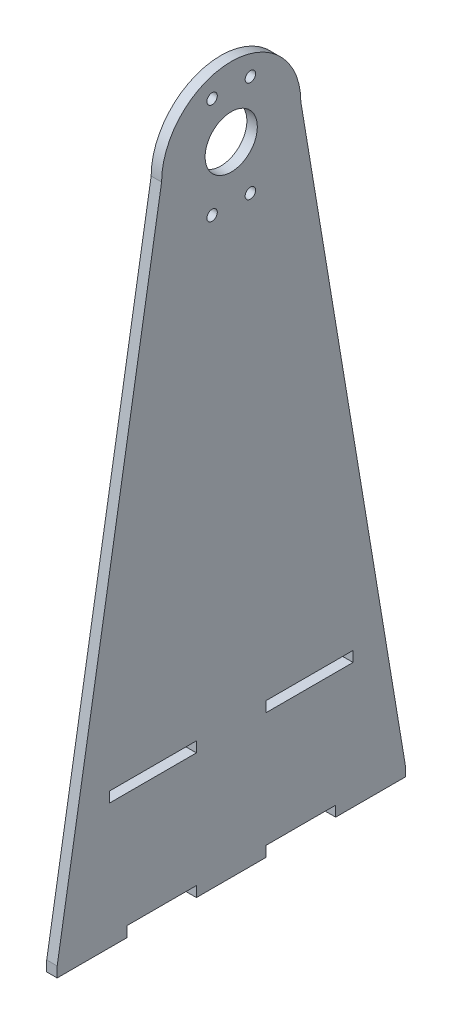
ISO-10303-21;
HEADER;
FILE_DESCRIPTION(('STEP AP214'),'2;1');
FILE_NAME('part.step','',(''),(''),'','','');
FILE_SCHEMA(('AUTOMOTIVE_DESIGN { 1 0 10303 214 1 1 1 1 }'));
ENDSEC;
DATA;
#1=APPLICATION_CONTEXT('core data for automotive mechanical design processes');
#2=APPLICATION_PROTOCOL_DEFINITION('international standard','automotive_design',2000,#1);
#3=PRODUCT_CONTEXT('',#1,'mechanical');
#4=PRODUCT('Part','Part','',(#3));
#5=PRODUCT_RELATED_PRODUCT_CATEGORY('part','',(#4));
#6=PRODUCT_DEFINITION_FORMATION('','',#4);
#7=PRODUCT_DEFINITION_CONTEXT('part definition',#1,'design');
#8=PRODUCT_DEFINITION('design','',#6,#7);
#9=PRODUCT_DEFINITION_SHAPE('','',#8);
#10=(LENGTH_UNIT() NAMED_UNIT(*) SI_UNIT(.MILLI.,.METRE.));
#11=(NAMED_UNIT(*) PLANE_ANGLE_UNIT() SI_UNIT($,.RADIAN.));
#12=(NAMED_UNIT(*) SI_UNIT($,.STERADIAN.) SOLID_ANGLE_UNIT());
#13=UNCERTAINTY_MEASURE_WITH_UNIT(LENGTH_MEASURE(1.E-05),#10,'distance_accuracy_value','');
#14=(GEOMETRIC_REPRESENTATION_CONTEXT(3) GLOBAL_UNCERTAINTY_ASSIGNED_CONTEXT((#13)) GLOBAL_UNIT_ASSIGNED_CONTEXT((#10,
#11,#12)) REPRESENTATION_CONTEXT('',''));
#15=CARTESIAN_POINT('',(0.,0.,0.));
#16=DIRECTION('',(0.,0.,1.));
#17=DIRECTION('',(1.,0.,0.));
#18=AXIS2_PLACEMENT_3D('',#15,#16,#17);
#19=CARTESIAN_POINT('',(1.5,180.,0.));
#20=DIRECTION('',(1.,0.,0.));
#21=DIRECTION('',(0.,0.,-1.));
#22=AXIS2_PLACEMENT_3D('',#19,#20,#21);
#23=PLANE('',#22);
#24=CARTESIAN_POINT('',(1.5,164.5,5.5));
#25=DIRECTION('',(1.,0.,0.));
#26=DIRECTION('',(0.,0.,-1.));
#27=AXIS2_PLACEMENT_3D('',#24,#25,#26);
#28=CIRCLE('',#27,1.5);
#29=CARTESIAN_POINT('',(1.5,164.5,4.));
#30=VERTEX_POINT('',#29);
#31=EDGE_CURVE('E436',#30,#30,#28,.F.);
#32=ORIENTED_EDGE('',*,*,#31,.T.);
#33=EDGE_LOOP('',(#32));
#34=FACE_BOUND('',#33,.T.);
#35=CARTESIAN_POINT('',(1.5,193.5,5.5));
#36=DIRECTION('',(1.,0.,0.));
#37=DIRECTION('',(0.,0.,-1.));
#38=AXIS2_PLACEMENT_3D('',#35,#36,#37);
#39=CIRCLE('',#38,1.5);
#40=CARTESIAN_POINT('',(1.5,193.5,4.));
#41=VERTEX_POINT('',#40);
#42=EDGE_CURVE('E223',#41,#41,#39,.T.);
#43=ORIENTED_EDGE('',*,*,#42,.F.);
#44=EDGE_LOOP('',(#43));
#45=FACE_BOUND('',#44,.T.);
#46=DIRECTION('',(0.,-1.,0.));
#47=VECTOR('',#46,1.);
#48=CARTESIAN_POINT('',(1.5,180.,-10.));
#49=LINE('',#48,#47);
#50=CARTESIAN_POINT('',(1.5,36.,-10.));
#51=VERTEX_POINT('',#50);
#52=CARTESIAN_POINT('',(1.5,33.,-10.));
#53=VERTEX_POINT('',#52);
#54=EDGE_CURVE('E360',#51,#53,#49,.T.);
#55=ORIENTED_EDGE('',*,*,#54,.F.);
#56=DIRECTION('',(0.,0.,1.));
#57=VECTOR('',#56,1.);
#58=CARTESIAN_POINT('',(1.5,36.,0.));
#59=LINE('',#58,#57);
#60=CARTESIAN_POINT('',(1.5,36.,-35.));
#61=VERTEX_POINT('',#60);
#62=EDGE_CURVE('E353',#61,#51,#59,.T.);
#63=ORIENTED_EDGE('',*,*,#62,.F.);
#64=DIRECTION('',(0.,1.,0.));
#65=VECTOR('',#64,1.);
#66=CARTESIAN_POINT('',(1.5,180.,-35.));
#67=LINE('',#66,#65);
#68=CARTESIAN_POINT('',(1.5,33.,-35.));
#69=VERTEX_POINT('',#68);
#70=EDGE_CURVE('E355',#69,#61,#67,.T.);
#71=ORIENTED_EDGE('',*,*,#70,.F.);
#72=DIRECTION('',(0.,0.,-1.));
#73=VECTOR('',#72,1.);
#74=CARTESIAN_POINT('',(1.5,33.,0.));
#75=LINE('',#74,#73);
#76=EDGE_CURVE('E358',#53,#69,#75,.T.);
#77=ORIENTED_EDGE('',*,*,#76,.F.);
#78=EDGE_LOOP('',(#55,#63,#71,#77));
#79=FACE_BOUND('',#78,.T.);
#80=DIRECTION('',(0.,0.,1.));
#81=VECTOR('',#80,1.);
#82=CARTESIAN_POINT('',(1.5,36.,0.));
#83=LINE('',#82,#81);
#84=CARTESIAN_POINT('',(1.5,36.,10.));
#85=VERTEX_POINT('',#84);
#86=CARTESIAN_POINT('',(1.5,36.,35.));
#87=VERTEX_POINT('',#86);
#88=EDGE_CURVE('E351',#85,#87,#83,.T.);
#89=ORIENTED_EDGE('',*,*,#88,.F.);
#90=DIRECTION('',(0.,1.,0.));
#91=VECTOR('',#90,1.);
#92=CARTESIAN_POINT('',(1.5,180.,10.));
#93=LINE('',#92,#91);
#94=CARTESIAN_POINT('',(1.5,33.,10.));
#95=VERTEX_POINT('',#94);
#96=EDGE_CURVE('E320',#95,#85,#93,.T.);
#97=ORIENTED_EDGE('',*,*,#96,.F.);
#98=DIRECTION('',(0.,0.,-1.));
#99=VECTOR('',#98,1.);
#100=CARTESIAN_POINT('',(1.5,33.,0.));
#101=LINE('',#100,#99);
#102=CARTESIAN_POINT('',(1.5,33.,35.));
#103=VERTEX_POINT('',#102);
#104=EDGE_CURVE('E346',#103,#95,#101,.T.);
#105=ORIENTED_EDGE('',*,*,#104,.F.);
#106=DIRECTION('',(0.,-1.,0.));
#107=VECTOR('',#106,1.);
#108=CARTESIAN_POINT('',(1.5,180.,35.));
#109=LINE('',#108,#107);
#110=EDGE_CURVE('E349',#87,#103,#109,.T.);
#111=ORIENTED_EDGE('',*,*,#110,.F.);
#112=EDGE_LOOP('',(#89,#97,#105,#111));
#113=FACE_BOUND('',#112,.T.);
#114=DIRECTION('',(0.,0.986393923832144,0.164398987305357));
#115=VECTOR('',#114,1.);
#116=CARTESIAN_POINT('',(1.5,0.,-50.));
#117=LINE('',#116,#115);
#118=CARTESIAN_POINT('',(1.5,0.,-50.));
#119=VERTEX_POINT('',#118);
#120=CARTESIAN_POINT('',(1.5,180.,-20.));
#121=VERTEX_POINT('',#120);
#122=EDGE_CURVE('E267',#119,#121,#117,.T.);
#123=ORIENTED_EDGE('',*,*,#122,.T.);
#124=CARTESIAN_POINT('',(1.5,180.,0.));
#125=DIRECTION('',(1.,0.,0.));
#126=DIRECTION('',(0.,0.,-1.));
#127=AXIS2_PLACEMENT_3D('',#124,#125,#126);
#128=CIRCLE('',#127,20.);
#129=CARTESIAN_POINT('',(1.5,180.,20.));
#130=VERTEX_POINT('',#129);
#131=EDGE_CURVE('E270',#121,#130,#128,.T.);
#132=ORIENTED_EDGE('',*,*,#131,.T.);
#133=DIRECTION('',(0.,-0.986393923832144,0.164398987305357));
#134=VECTOR('',#133,1.);
#135=CARTESIAN_POINT('',(1.5,0.,50.));
#136=LINE('',#135,#134);
#137=CARTESIAN_POINT('',(1.5,0.,50.));
#138=VERTEX_POINT('',#137);
#139=EDGE_CURVE('E368',#130,#138,#136,.T.);
#140=ORIENTED_EDGE('',*,*,#139,.T.);
#141=DIRECTION('',(0.,1.,0.));
#142=VECTOR('',#141,1.);
#143=CARTESIAN_POINT('',(1.5,-3.00000000000001,50.));
#144=LINE('',#143,#142);
#145=CARTESIAN_POINT('',(1.5,-3.00000000000001,50.));
#146=VERTEX_POINT('',#145);
#147=EDGE_CURVE('E211',#146,#138,#144,.T.);
#148=ORIENTED_EDGE('',*,*,#147,.F.);
#149=DIRECTION('',(0.,0.,1.));
#150=VECTOR('',#149,1.);
#151=CARTESIAN_POINT('',(1.5,-3.,30.));
#152=LINE('',#151,#150);
#153=CARTESIAN_POINT('',(1.5,-3.,30.));
#154=VERTEX_POINT('',#153);
#155=EDGE_CURVE('E418',#154,#146,#152,.T.);
#156=ORIENTED_EDGE('',*,*,#155,.F.);
#157=DIRECTION('',(0.,1.,0.));
#158=VECTOR('',#157,1.);
#159=CARTESIAN_POINT('',(1.5,-3.,30.));
#160=LINE('',#159,#158);
#161=CARTESIAN_POINT('',(1.5,0.,30.));
#162=VERTEX_POINT('',#161);
#163=EDGE_CURVE('E419',#154,#162,#160,.T.);
#164=ORIENTED_EDGE('',*,*,#163,.T.);
#165=DIRECTION('',(0.,0.,-1.));
#166=VECTOR('',#165,1.);
#167=CARTESIAN_POINT('',(1.5,0.,-50.));
#168=LINE('',#167,#166);
#169=CARTESIAN_POINT('',(1.5,0.,10.));
#170=VERTEX_POINT('',#169);
#171=EDGE_CURVE('E52',#162,#170,#168,.T.);
#172=ORIENTED_EDGE('',*,*,#171,.T.);
#173=DIRECTION('',(0.,1.,0.));
#174=VECTOR('',#173,1.);
#175=CARTESIAN_POINT('',(1.5,-3.,10.));
#176=LINE('',#175,#174);
#177=CARTESIAN_POINT('',(1.5,-3.,10.));
#178=VERTEX_POINT('',#177);
#179=EDGE_CURVE('E297',#178,#170,#176,.T.);
#180=ORIENTED_EDGE('',*,*,#179,.F.);
#181=DIRECTION('',(0.,0.,1.));
#182=VECTOR('',#181,1.);
#183=CARTESIAN_POINT('',(1.5,-3.,0.));
#184=LINE('',#183,#182);
#185=CARTESIAN_POINT('',(1.5,-3.,-10.));
#186=VERTEX_POINT('',#185);
#187=EDGE_CURVE('E379',#186,#178,#184,.T.);
#188=ORIENTED_EDGE('',*,*,#187,.F.);
#189=DIRECTION('',(0.,1.,0.));
#190=VECTOR('',#189,1.);
#191=CARTESIAN_POINT('',(1.5,-3.,-10.));
#192=LINE('',#191,#190);
#193=CARTESIAN_POINT('',(1.5,0.,-9.99999999999999));
#194=VERTEX_POINT('',#193);
#195=EDGE_CURVE('E294',#186,#194,#192,.T.);
#196=ORIENTED_EDGE('',*,*,#195,.T.);
#197=CARTESIAN_POINT('',(1.5,0.,-30.));
#198=VERTEX_POINT('',#197);
#199=EDGE_CURVE('E369',#194,#198,#168,.T.);
#200=ORIENTED_EDGE('',*,*,#199,.T.);
#201=DIRECTION('',(0.,1.,0.));
#202=VECTOR('',#201,1.);
#203=CARTESIAN_POINT('',(1.5,-3.,-30.));
#204=LINE('',#203,#202);
#205=CARTESIAN_POINT('',(1.5,-3.,-30.));
#206=VERTEX_POINT('',#205);
#207=EDGE_CURVE('E376',#206,#198,#204,.T.);
#208=ORIENTED_EDGE('',*,*,#207,.F.);
#209=DIRECTION('',(0.,0.,1.));
#210=VECTOR('',#209,1.);
#211=CARTESIAN_POINT('',(1.5,-3.,0.));
#212=LINE('',#211,#210);
#213=CARTESIAN_POINT('',(1.5,-2.99999999999999,-50.));
#214=VERTEX_POINT('',#213);
#215=EDGE_CURVE('E387',#214,#206,#212,.T.);
#216=ORIENTED_EDGE('',*,*,#215,.F.);
#217=DIRECTION('',(0.,1.,0.));
#218=VECTOR('',#217,1.);
#219=CARTESIAN_POINT('',(1.5,-2.99999999999999,-50.));
#220=LINE('',#219,#218);
#221=EDGE_CURVE('E400',#214,#119,#220,.T.);
#222=ORIENTED_EDGE('',*,*,#221,.T.);
#223=EDGE_LOOP('',(#123,#132,#140,#148,#156,#164,#172,#180,#188,#196,#200,#208,#216,#222));
#224=FACE_BOUND('',#223,.T.);
#225=CARTESIAN_POINT('',(1.5,180.,0.));
#226=DIRECTION('',(1.,0.,0.));
#227=DIRECTION('',(0.,0.,-1.));
#228=AXIS2_PLACEMENT_3D('',#225,#226,#227);
#229=CIRCLE('',#228,7.5);
#230=CARTESIAN_POINT('',(1.5,180.,-7.5));
#231=VERTEX_POINT('',#230);
#232=EDGE_CURVE('E263',#231,#231,#229,.T.);
#233=ORIENTED_EDGE('',*,*,#232,.F.);
#234=EDGE_LOOP('',(#233));
#235=FACE_BOUND('',#234,.T.);
#236=CARTESIAN_POINT('',(1.5,164.5,-5.5));
#237=DIRECTION('',(1.,0.,0.));
#238=DIRECTION('',(0.,0.,-1.));
#239=AXIS2_PLACEMENT_3D('',#236,#237,#238);
#240=CIRCLE('',#239,1.5);
#241=CARTESIAN_POINT('',(1.5,164.5,-7.));
#242=VERTEX_POINT('',#241);
#243=EDGE_CURVE('E440',#242,#242,#240,.T.);
#244=ORIENTED_EDGE('',*,*,#243,.F.);
#245=EDGE_LOOP('',(#244));
#246=FACE_BOUND('',#245,.T.);
#247=CARTESIAN_POINT('',(1.5,193.5,-5.5));
#248=DIRECTION('',(-1.,0.,0.));
#249=DIRECTION('',(0.,0.,1.));
#250=AXIS2_PLACEMENT_3D('',#247,#248,#249);
#251=CIRCLE('',#250,1.5);
#252=CARTESIAN_POINT('',(1.5,193.5,-4.));
#253=VERTEX_POINT('',#252);
#254=EDGE_CURVE('E437',#253,#253,#251,.T.);
#255=ORIENTED_EDGE('',*,*,#254,.T.);
#256=EDGE_LOOP('',(#255));
#257=FACE_BOUND('',#256,.T.);
#258=ADVANCED_FACE('F35',(#34,#45,#79,#113,#224,#235,#246,#257),#23,.T.);
#259=CARTESIAN_POINT('',(-1.5,180.,0.));
#260=DIRECTION('',(1.,0.,0.));
#261=DIRECTION('',(0.,0.,-1.));
#262=AXIS2_PLACEMENT_3D('',#259,#260,#261);
#263=PLANE('',#262);
#264=CARTESIAN_POINT('',(-1.5,164.5,-5.5));
#265=DIRECTION('',(1.,0.,0.));
#266=DIRECTION('',(0.,0.,-1.));
#267=AXIS2_PLACEMENT_3D('',#264,#265,#266);
#268=CIRCLE('',#267,1.5);
#269=CARTESIAN_POINT('',(-1.5,164.5,-7.));
#270=VERTEX_POINT('',#269);
#271=EDGE_CURVE('E225',#270,#270,#268,.T.);
#272=ORIENTED_EDGE('',*,*,#271,.T.);
#273=EDGE_LOOP('',(#272));
#274=FACE_BOUND('',#273,.T.);
#275=CARTESIAN_POINT('',(-1.5,193.5,5.5));
#276=DIRECTION('',(1.,0.,0.));
#277=DIRECTION('',(0.,0.,-1.));
#278=AXIS2_PLACEMENT_3D('',#275,#276,#277);
#279=CIRCLE('',#278,1.5);
#280=CARTESIAN_POINT('',(-1.5,193.5,4.));
#281=VERTEX_POINT('',#280);
#282=EDGE_CURVE('E219',#281,#281,#279,.T.);
#283=ORIENTED_EDGE('',*,*,#282,.T.);
#284=EDGE_LOOP('',(#283));
#285=FACE_BOUND('',#284,.T.);
#286=DIRECTION('',(0.,0.,-1.));
#287=VECTOR('',#286,1.);
#288=CARTESIAN_POINT('',(-1.5,36.,-10.));
#289=LINE('',#288,#287);
#290=CARTESIAN_POINT('',(-1.5,36.,-10.));
#291=VERTEX_POINT('',#290);
#292=CARTESIAN_POINT('',(-1.5,36.,-35.));
#293=VERTEX_POINT('',#292);
#294=EDGE_CURVE('E307',#291,#293,#289,.T.);
#295=ORIENTED_EDGE('',*,*,#294,.F.);
#296=DIRECTION('',(0.,1.,0.));
#297=VECTOR('',#296,1.);
#298=CARTESIAN_POINT('',(-1.5,36.,-10.));
#299=LINE('',#298,#297);
#300=CARTESIAN_POINT('',(-1.5,33.,-10.));
#301=VERTEX_POINT('',#300);
#302=EDGE_CURVE('E305',#301,#291,#299,.T.);
#303=ORIENTED_EDGE('',*,*,#302,.F.);
#304=DIRECTION('',(0.,0.,1.));
#305=VECTOR('',#304,1.);
#306=CARTESIAN_POINT('',(-1.5,33.,-10.));
#307=LINE('',#306,#305);
#308=CARTESIAN_POINT('',(-1.5,33.,-35.));
#309=VERTEX_POINT('',#308);
#310=EDGE_CURVE('E314',#309,#301,#307,.T.);
#311=ORIENTED_EDGE('',*,*,#310,.F.);
#312=DIRECTION('',(0.,-1.,0.));
#313=VECTOR('',#312,1.);
#314=CARTESIAN_POINT('',(-1.5,36.,-35.));
#315=LINE('',#314,#313);
#316=EDGE_CURVE('E311',#293,#309,#315,.T.);
#317=ORIENTED_EDGE('',*,*,#316,.F.);
#318=EDGE_LOOP('',(#295,#303,#311,#317));
#319=FACE_BOUND('',#318,.T.);
#320=DIRECTION('',(0.,-1.,0.));
#321=VECTOR('',#320,1.);
#322=CARTESIAN_POINT('',(-1.5,36.,10.));
#323=LINE('',#322,#321);
#324=CARTESIAN_POINT('',(-1.5,36.,10.));
#325=VERTEX_POINT('',#324);
#326=CARTESIAN_POINT('',(-1.5,33.,10.));
#327=VERTEX_POINT('',#326);
#328=EDGE_CURVE('E328',#325,#327,#323,.T.);
#329=ORIENTED_EDGE('',*,*,#328,.F.);
#330=DIRECTION('',(0.,0.,-1.));
#331=VECTOR('',#330,1.);
#332=CARTESIAN_POINT('',(-1.5,36.,10.));
#333=LINE('',#332,#331);
#334=CARTESIAN_POINT('',(-1.5,36.,35.));
#335=VERTEX_POINT('',#334);
#336=EDGE_CURVE('E304',#335,#325,#333,.T.);
#337=ORIENTED_EDGE('',*,*,#336,.F.);
#338=DIRECTION('',(0.,1.,0.));
#339=VECTOR('',#338,1.);
#340=CARTESIAN_POINT('',(-1.5,36.,35.));
#341=LINE('',#340,#339);
#342=CARTESIAN_POINT('',(-1.5,33.,35.));
#343=VERTEX_POINT('',#342);
#344=EDGE_CURVE('E334',#343,#335,#341,.T.);
#345=ORIENTED_EDGE('',*,*,#344,.F.);
#346=DIRECTION('',(0.,0.,1.));
#347=VECTOR('',#346,1.);
#348=CARTESIAN_POINT('',(-1.5,33.,10.));
#349=LINE('',#348,#347);
#350=EDGE_CURVE('E331',#327,#343,#349,.T.);
#351=ORIENTED_EDGE('',*,*,#350,.F.);
#352=EDGE_LOOP('',(#329,#337,#345,#351));
#353=FACE_BOUND('',#352,.T.);
#354=DIRECTION('',(0.,0.986393923832144,0.164398987305357));
#355=VECTOR('',#354,1.);
#356=CARTESIAN_POINT('',(-1.5,0.,-50.));
#357=LINE('',#356,#355);
#358=CARTESIAN_POINT('',(-1.5,0.,-50.));
#359=VERTEX_POINT('',#358);
#360=CARTESIAN_POINT('',(-1.5,180.,-20.));
#361=VERTEX_POINT('',#360);
#362=EDGE_CURVE('E261',#359,#361,#357,.T.);
#363=ORIENTED_EDGE('',*,*,#362,.F.);
#364=DIRECTION('',(0.,1.,0.));
#365=VECTOR('',#364,1.);
#366=CARTESIAN_POINT('',(-1.5,-2.99999999999999,-50.));
#367=LINE('',#366,#365);
#368=CARTESIAN_POINT('',(-1.5,-2.99999999999999,-50.));
#369=VERTEX_POINT('',#368);
#370=EDGE_CURVE('E409',#369,#359,#367,.T.);
#371=ORIENTED_EDGE('',*,*,#370,.F.);
#372=DIRECTION('',(0.,0.,-1.));
#373=VECTOR('',#372,1.);
#374=CARTESIAN_POINT('',(-1.5,-3.,0.));
#375=LINE('',#374,#373);
#376=CARTESIAN_POINT('',(-1.5,-3.,-30.));
#377=VERTEX_POINT('',#376);
#378=EDGE_CURVE('E404',#377,#369,#375,.T.);
#379=ORIENTED_EDGE('',*,*,#378,.F.);
#380=DIRECTION('',(0.,1.,0.));
#381=VECTOR('',#380,1.);
#382=CARTESIAN_POINT('',(-1.5,-3.,-30.));
#383=LINE('',#382,#381);
#384=CARTESIAN_POINT('',(-1.5,0.,-30.));
#385=VERTEX_POINT('',#384);
#386=EDGE_CURVE('E287',#377,#385,#383,.T.);
#387=ORIENTED_EDGE('',*,*,#386,.T.);
#388=DIRECTION('',(0.,0.,-1.));
#389=VECTOR('',#388,1.);
#390=CARTESIAN_POINT('',(-1.5,0.,-50.));
#391=LINE('',#390,#389);
#392=CARTESIAN_POINT('',(-1.5,0.,-9.99999999999999));
#393=VERTEX_POINT('',#392);
#394=EDGE_CURVE('E194',#393,#385,#391,.T.);
#395=ORIENTED_EDGE('',*,*,#394,.F.);
#396=DIRECTION('',(0.,1.,0.));
#397=VECTOR('',#396,1.);
#398=CARTESIAN_POINT('',(-1.5,-3.,-10.));
#399=LINE('',#398,#397);
#400=CARTESIAN_POINT('',(-1.5,-3.,-10.));
#401=VERTEX_POINT('',#400);
#402=EDGE_CURVE('E283',#401,#393,#399,.T.);
#403=ORIENTED_EDGE('',*,*,#402,.F.);
#404=DIRECTION('',(0.,0.,-1.));
#405=VECTOR('',#404,1.);
#406=CARTESIAN_POINT('',(-1.5,-3.,0.));
#407=LINE('',#406,#405);
#408=CARTESIAN_POINT('',(-1.5,-3.,10.));
#409=VERTEX_POINT('',#408);
#410=EDGE_CURVE('E383',#409,#401,#407,.T.);
#411=ORIENTED_EDGE('',*,*,#410,.F.);
#412=DIRECTION('',(0.,1.,0.));
#413=VECTOR('',#412,1.);
#414=CARTESIAN_POINT('',(-1.5,-3.,10.));
#415=LINE('',#414,#413);
#416=CARTESIAN_POINT('',(-1.5,0.,10.));
#417=VERTEX_POINT('',#416);
#418=EDGE_CURVE('E293',#409,#417,#415,.T.);
#419=ORIENTED_EDGE('',*,*,#418,.T.);
#420=CARTESIAN_POINT('',(-1.5,0.,30.));
#421=VERTEX_POINT('',#420);
#422=EDGE_CURVE('E266',#421,#417,#391,.T.);
#423=ORIENTED_EDGE('',*,*,#422,.F.);
#424=DIRECTION('',(0.,1.,0.));
#425=VECTOR('',#424,1.);
#426=CARTESIAN_POINT('',(-1.5,-3.,30.));
#427=LINE('',#426,#425);
#428=CARTESIAN_POINT('',(-1.5,-3.,30.));
#429=VERTEX_POINT('',#428);
#430=EDGE_CURVE('E207',#429,#421,#427,.T.);
#431=ORIENTED_EDGE('',*,*,#430,.F.);
#432=DIRECTION('',(0.,0.,-1.));
#433=VECTOR('',#432,1.);
#434=CARTESIAN_POINT('',(-1.5,-3.00000000000001,50.));
#435=LINE('',#434,#433);
#436=CARTESIAN_POINT('',(-1.5,-3.00000000000001,50.));
#437=VERTEX_POINT('',#436);
#438=EDGE_CURVE('E203',#437,#429,#435,.T.);
#439=ORIENTED_EDGE('',*,*,#438,.F.);
#440=DIRECTION('',(0.,1.,0.));
#441=VECTOR('',#440,1.);
#442=CARTESIAN_POINT('',(-1.5,-3.00000000000001,50.));
#443=LINE('',#442,#441);
#444=CARTESIAN_POINT('',(-1.5,0.,50.));
#445=VERTEX_POINT('',#444);
#446=EDGE_CURVE('E198',#437,#445,#443,.T.);
#447=ORIENTED_EDGE('',*,*,#446,.T.);
#448=DIRECTION('',(0.,-0.986393923832144,0.164398987305357));
#449=VECTOR('',#448,1.);
#450=CARTESIAN_POINT('',(-1.5,0.,50.));
#451=LINE('',#450,#449);
#452=CARTESIAN_POINT('',(-1.5,180.,20.));
#453=VERTEX_POINT('',#452);
#454=EDGE_CURVE('E185',#453,#445,#451,.T.);
#455=ORIENTED_EDGE('',*,*,#454,.F.);
#456=CARTESIAN_POINT('',(-1.5,180.,0.));
#457=DIRECTION('',(1.,0.,0.));
#458=DIRECTION('',(0.,0.,-1.));
#459=AXIS2_PLACEMENT_3D('',#456,#457,#458);
#460=CIRCLE('',#459,20.);
#461=EDGE_CURVE('E195',#361,#453,#460,.T.);
#462=ORIENTED_EDGE('',*,*,#461,.F.);
#463=EDGE_LOOP('',(#363,#371,#379,#387,#395,#403,#411,#419,#423,#431,#439,#447,#455,#462));
#464=FACE_BOUND('',#463,.T.);
#465=CARTESIAN_POINT('',(-1.5,180.,0.));
#466=DIRECTION('',(1.,0.,0.));
#467=DIRECTION('',(0.,0.,-1.));
#468=AXIS2_PLACEMENT_3D('',#465,#466,#467);
#469=CIRCLE('',#468,7.5);
#470=CARTESIAN_POINT('',(-1.5,180.,-7.5));
#471=VERTEX_POINT('',#470);
#472=EDGE_CURVE('E362',#471,#471,#469,.T.);
#473=ORIENTED_EDGE('',*,*,#472,.T.);
#474=EDGE_LOOP('',(#473));
#475=FACE_BOUND('',#474,.T.);
#476=CARTESIAN_POINT('',(-1.5,164.5,5.5));
#477=DIRECTION('',(1.,0.,0.));
#478=DIRECTION('',(0.,0.,-1.));
#479=AXIS2_PLACEMENT_3D('',#476,#477,#478);
#480=CIRCLE('',#479,1.5);
#481=CARTESIAN_POINT('',(-1.5,164.5,4.));
#482=VERTEX_POINT('',#481);
#483=EDGE_CURVE('E222',#482,#482,#480,.F.);
#484=ORIENTED_EDGE('',*,*,#483,.F.);
#485=EDGE_LOOP('',(#484));
#486=FACE_BOUND('',#485,.T.);
#487=CARTESIAN_POINT('',(-1.5,193.5,-5.5));
#488=DIRECTION('',(1.,0.,0.));
#489=DIRECTION('',(0.,0.,-1.));
#490=AXIS2_PLACEMENT_3D('',#487,#488,#489);
#491=CIRCLE('',#490,1.5);
#492=CARTESIAN_POINT('',(-1.5,193.5,-7.));
#493=VERTEX_POINT('',#492);
#494=EDGE_CURVE('E39',#493,#493,#491,.F.);
#495=ORIENTED_EDGE('',*,*,#494,.F.);
#496=EDGE_LOOP('',(#495));
#497=FACE_BOUND('',#496,.T.);
#498=ADVANCED_FACE('F200',(#274,#285,#319,#353,#464,#475,#486,#497),#263,.F.);
#499=CARTESIAN_POINT('',(1.5,0.,-50.));
#500=DIRECTION('',(0.,1.,0.));
#501=DIRECTION('',(0.,0.,1.));
#502=AXIS2_PLACEMENT_3D('',#499,#500,#501);
#503=PLANE('',#502);
#504=DIRECTION('',(1.,0.,0.));
#505=VECTOR('',#504,1.);
#506=CARTESIAN_POINT('',(-1.5,0.,30.));
#507=LINE('',#506,#505);
#508=EDGE_CURVE('E56',#421,#162,#507,.T.);
#509=ORIENTED_EDGE('',*,*,#508,.F.);
#510=ORIENTED_EDGE('',*,*,#422,.T.);
#511=DIRECTION('',(-1.,0.,0.));
#512=VECTOR('',#511,1.);
#513=CARTESIAN_POINT('',(0.,0.,10.));
#514=LINE('',#513,#512);
#515=EDGE_CURVE('E385',#170,#417,#514,.T.);
#516=ORIENTED_EDGE('',*,*,#515,.F.);
#517=ORIENTED_EDGE('',*,*,#171,.F.);
#518=EDGE_LOOP('',(#509,#510,#516,#517));
#519=FACE_BOUND('',#518,.T.);
#520=ADVANCED_FACE('F235',(#519),#503,.F.);
#521=DIRECTION('',(-1.,0.,0.));
#522=VECTOR('',#521,1.);
#523=CARTESIAN_POINT('',(0.,0.,-30.));
#524=LINE('',#523,#522);
#525=EDGE_CURVE('E275',#198,#385,#524,.T.);
#526=ORIENTED_EDGE('',*,*,#525,.F.);
#527=ORIENTED_EDGE('',*,*,#199,.F.);
#528=DIRECTION('',(1.,0.,0.));
#529=VECTOR('',#528,1.);
#530=CARTESIAN_POINT('',(0.,0.,-10.));
#531=LINE('',#530,#529);
#532=EDGE_CURVE('E278',#393,#194,#531,.T.);
#533=ORIENTED_EDGE('',*,*,#532,.F.);
#534=ORIENTED_EDGE('',*,*,#394,.T.);
#535=EDGE_LOOP('',(#526,#527,#533,#534));
#536=FACE_BOUND('',#535,.T.);
#537=ADVANCED_FACE('F241',(#536),#503,.F.);
#538=CARTESIAN_POINT('',(1.5,0.,-50.));
#539=DIRECTION('',(0.,-0.164398987305357,0.986393923832144));
#540=DIRECTION('',(0.,-0.986393923832144,-0.164398987305357));
#541=AXIS2_PLACEMENT_3D('',#538,#539,#540);
#542=PLANE('',#541);
#543=ORIENTED_EDGE('',*,*,#362,.T.);
#544=DIRECTION('',(-1.,0.,0.));
#545=VECTOR('',#544,1.);
#546=CARTESIAN_POINT('',(1.5,180.,-20.));
#547=LINE('',#546,#545);
#548=EDGE_CURVE('E11',#121,#361,#547,.T.);
#549=ORIENTED_EDGE('',*,*,#548,.F.);
#550=ORIENTED_EDGE('',*,*,#122,.F.);
#551=DIRECTION('',(-1.,0.,0.));
#552=VECTOR('',#551,1.);
#553=CARTESIAN_POINT('',(1.5,0.,-50.));
#554=LINE('',#553,#552);
#555=EDGE_CURVE('E212',#119,#359,#554,.T.);
#556=ORIENTED_EDGE('',*,*,#555,.T.);
#557=EDGE_LOOP('',(#543,#549,#550,#556));
#558=FACE_BOUND('',#557,.T.);
#559=ADVANCED_FACE('F37',(#558),#542,.F.);
#560=CARTESIAN_POINT('',(1.5,180.,0.));
#561=DIRECTION('',(-1.,0.,0.));
#562=DIRECTION('',(0.,0.,1.));
#563=AXIS2_PLACEMENT_3D('',#560,#561,#562);
#564=CYLINDRICAL_SURFACE('',#563,20.);
#565=ORIENTED_EDGE('',*,*,#461,.T.);
#566=DIRECTION('',(-1.,0.,0.));
#567=VECTOR('',#566,1.);
#568=CARTESIAN_POINT('',(1.5,180.,20.));
#569=LINE('',#568,#567);
#570=EDGE_CURVE('E44',#130,#453,#569,.T.);
#571=ORIENTED_EDGE('',*,*,#570,.F.);
#572=ORIENTED_EDGE('',*,*,#131,.F.);
#573=ORIENTED_EDGE('',*,*,#548,.T.);
#574=EDGE_LOOP('',(#565,#571,#572,#573));
#575=FACE_BOUND('',#574,.T.);
#576=ADVANCED_FACE('F252',(#575),#564,.T.);
#577=CARTESIAN_POINT('',(1.5,0.,50.));
#578=DIRECTION('',(0.,-0.164398987305357,-0.986393923832144));
#579=DIRECTION('',(0.,0.986393923832144,-0.164398987305357));
#580=AXIS2_PLACEMENT_3D('',#577,#578,#579);
#581=PLANE('',#580);
#582=ORIENTED_EDGE('',*,*,#454,.T.);
#583=DIRECTION('',(-1.,0.,0.));
#584=VECTOR('',#583,1.);
#585=CARTESIAN_POINT('',(1.5,0.,50.));
#586=LINE('',#585,#584);
#587=EDGE_CURVE('E190',#138,#445,#586,.T.);
#588=ORIENTED_EDGE('',*,*,#587,.F.);
#589=ORIENTED_EDGE('',*,*,#139,.F.);
#590=ORIENTED_EDGE('',*,*,#570,.T.);
#591=EDGE_LOOP('',(#582,#588,#589,#590));
#592=FACE_BOUND('',#591,.T.);
#593=ADVANCED_FACE('F187',(#592),#581,.F.);
#594=CARTESIAN_POINT('',(1.5,180.,0.));
#595=DIRECTION('',(-1.,0.,0.));
#596=DIRECTION('',(0.,0.,1.));
#597=AXIS2_PLACEMENT_3D('',#594,#595,#596);
#598=CYLINDRICAL_SURFACE('',#597,7.5);
#599=ORIENTED_EDGE('',*,*,#232,.T.);
#600=EDGE_LOOP('',(#599));
#601=FACE_BOUND('',#600,.T.);
#602=ORIENTED_EDGE('',*,*,#472,.F.);
#603=EDGE_LOOP('',(#602));
#604=FACE_BOUND('',#603,.T.);
#605=ADVANCED_FACE('F251',(#601,#604),#598,.F.);
#606=CARTESIAN_POINT('',(2.5,36.,10.));
#607=DIRECTION('',(0.,1.,0.));
#608=DIRECTION('',(0.,0.,1.));
#609=AXIS2_PLACEMENT_3D('',#606,#607,#608);
#610=PLANE('',#609);
#611=ORIENTED_EDGE('',*,*,#88,.T.);
#612=DIRECTION('',(-1.,0.,0.));
#613=VECTOR('',#612,1.);
#614=CARTESIAN_POINT('',(2.5,36.,35.));
#615=LINE('',#614,#613);
#616=EDGE_CURVE('E308',#87,#335,#615,.T.);
#617=ORIENTED_EDGE('',*,*,#616,.T.);
#618=ORIENTED_EDGE('',*,*,#336,.T.);
#619=DIRECTION('',(-1.,0.,0.));
#620=VECTOR('',#619,1.);
#621=CARTESIAN_POINT('',(2.5,36.,10.));
#622=LINE('',#621,#620);
#623=EDGE_CURVE('E337',#85,#325,#622,.T.);
#624=ORIENTED_EDGE('',*,*,#623,.F.);
#625=EDGE_LOOP('',(#611,#617,#618,#624));
#626=FACE_BOUND('',#625,.T.);
#627=ADVANCED_FACE('F511',(#626),#610,.F.);
#628=CARTESIAN_POINT('',(2.5,36.,35.));
#629=DIRECTION('',(0.,0.,1.));
#630=DIRECTION('',(1.,0.,0.));
#631=AXIS2_PLACEMENT_3D('',#628,#629,#630);
#632=PLANE('',#631);
#633=ORIENTED_EDGE('',*,*,#110,.T.);
#634=DIRECTION('',(-1.,0.,0.));
#635=VECTOR('',#634,1.);
#636=CARTESIAN_POINT('',(2.5,33.,35.));
#637=LINE('',#636,#635);
#638=EDGE_CURVE('E339',#103,#343,#637,.T.);
#639=ORIENTED_EDGE('',*,*,#638,.T.);
#640=ORIENTED_EDGE('',*,*,#344,.T.);
#641=ORIENTED_EDGE('',*,*,#616,.F.);
#642=EDGE_LOOP('',(#633,#639,#640,#641));
#643=FACE_BOUND('',#642,.T.);
#644=ADVANCED_FACE('F507',(#643),#632,.F.);
#645=CARTESIAN_POINT('',(2.5,33.,10.));
#646=DIRECTION('',(0.,-1.,0.));
#647=DIRECTION('',(0.,0.,-1.));
#648=AXIS2_PLACEMENT_3D('',#645,#646,#647);
#649=PLANE('',#648);
#650=ORIENTED_EDGE('',*,*,#104,.T.);
#651=DIRECTION('',(-1.,0.,0.));
#652=VECTOR('',#651,1.);
#653=CARTESIAN_POINT('',(2.5,33.,10.));
#654=LINE('',#653,#652);
#655=EDGE_CURVE('E341',#95,#327,#654,.T.);
#656=ORIENTED_EDGE('',*,*,#655,.T.);
#657=ORIENTED_EDGE('',*,*,#350,.T.);
#658=ORIENTED_EDGE('',*,*,#638,.F.);
#659=EDGE_LOOP('',(#650,#656,#657,#658));
#660=FACE_BOUND('',#659,.T.);
#661=ADVANCED_FACE('F510',(#660),#649,.F.);
#662=CARTESIAN_POINT('',(2.5,36.,10.));
#663=DIRECTION('',(0.,0.,-1.));
#664=DIRECTION('',(-1.,0.,0.));
#665=AXIS2_PLACEMENT_3D('',#662,#663,#664);
#666=PLANE('',#665);
#667=ORIENTED_EDGE('',*,*,#96,.T.);
#668=ORIENTED_EDGE('',*,*,#623,.T.);
#669=ORIENTED_EDGE('',*,*,#328,.T.);
#670=ORIENTED_EDGE('',*,*,#655,.F.);
#671=EDGE_LOOP('',(#667,#668,#669,#670));
#672=FACE_BOUND('',#671,.T.);
#673=ADVANCED_FACE('F505',(#672),#666,.F.);
#674=CARTESIAN_POINT('',(2.5,36.,-10.));
#675=DIRECTION('',(0.,0.,1.));
#676=DIRECTION('',(1.,0.,0.));
#677=AXIS2_PLACEMENT_3D('',#674,#675,#676);
#678=PLANE('',#677);
#679=ORIENTED_EDGE('',*,*,#54,.T.);
#680=DIRECTION('',(-1.,0.,0.));
#681=VECTOR('',#680,1.);
#682=CARTESIAN_POINT('',(2.5,33.,-10.));
#683=LINE('',#682,#681);
#684=EDGE_CURVE('E318',#53,#301,#683,.T.);
#685=ORIENTED_EDGE('',*,*,#684,.T.);
#686=ORIENTED_EDGE('',*,*,#302,.T.);
#687=DIRECTION('',(-1.,0.,0.));
#688=VECTOR('',#687,1.);
#689=CARTESIAN_POINT('',(2.5,36.,-10.));
#690=LINE('',#689,#688);
#691=EDGE_CURVE('E317',#51,#291,#690,.T.);
#692=ORIENTED_EDGE('',*,*,#691,.F.);
#693=EDGE_LOOP('',(#679,#685,#686,#692));
#694=FACE_BOUND('',#693,.T.);
#695=ADVANCED_FACE('F495',(#694),#678,.F.);
#696=CARTESIAN_POINT('',(2.5,33.,-10.));
#697=DIRECTION('',(0.,-1.,0.));
#698=DIRECTION('',(0.,0.,-1.));
#699=AXIS2_PLACEMENT_3D('',#696,#697,#698);
#700=PLANE('',#699);
#701=ORIENTED_EDGE('',*,*,#76,.T.);
#702=DIRECTION('',(-1.,0.,0.));
#703=VECTOR('',#702,1.);
#704=CARTESIAN_POINT('',(2.5,33.,-35.));
#705=LINE('',#704,#703);
#706=EDGE_CURVE('E321',#69,#309,#705,.T.);
#707=ORIENTED_EDGE('',*,*,#706,.T.);
#708=ORIENTED_EDGE('',*,*,#310,.T.);
#709=ORIENTED_EDGE('',*,*,#684,.F.);
#710=EDGE_LOOP('',(#701,#707,#708,#709));
#711=FACE_BOUND('',#710,.T.);
#712=ADVANCED_FACE('F491',(#711),#700,.F.);
#713=CARTESIAN_POINT('',(2.5,36.,-35.));
#714=DIRECTION('',(0.,0.,-1.));
#715=DIRECTION('',(-1.,0.,0.));
#716=AXIS2_PLACEMENT_3D('',#713,#714,#715);
#717=PLANE('',#716);
#718=ORIENTED_EDGE('',*,*,#70,.T.);
#719=DIRECTION('',(-1.,0.,0.));
#720=VECTOR('',#719,1.);
#721=CARTESIAN_POINT('',(2.5,36.,-35.));
#722=LINE('',#721,#720);
#723=EDGE_CURVE('E323',#61,#293,#722,.T.);
#724=ORIENTED_EDGE('',*,*,#723,.T.);
#725=ORIENTED_EDGE('',*,*,#316,.T.);
#726=ORIENTED_EDGE('',*,*,#706,.F.);
#727=EDGE_LOOP('',(#718,#724,#725,#726));
#728=FACE_BOUND('',#727,.T.);
#729=ADVANCED_FACE('F494',(#728),#717,.F.);
#730=CARTESIAN_POINT('',(2.5,36.,-10.));
#731=DIRECTION('',(0.,1.,0.));
#732=DIRECTION('',(0.,0.,1.));
#733=AXIS2_PLACEMENT_3D('',#730,#731,#732);
#734=PLANE('',#733);
#735=ORIENTED_EDGE('',*,*,#62,.T.);
#736=ORIENTED_EDGE('',*,*,#691,.T.);
#737=ORIENTED_EDGE('',*,*,#294,.T.);
#738=ORIENTED_EDGE('',*,*,#723,.F.);
#739=EDGE_LOOP('',(#735,#736,#737,#738));
#740=FACE_BOUND('',#739,.T.);
#741=ADVANCED_FACE('F490',(#740),#734,.F.);
#742=CARTESIAN_POINT('',(0.,-3.,10.));
#743=DIRECTION('',(0.,0.,-1.));
#744=DIRECTION('',(0.,1.,0.));
#745=AXIS2_PLACEMENT_3D('',#742,#743,#744);
#746=PLANE('',#745);
#747=ORIENTED_EDGE('',*,*,#515,.T.);
#748=ORIENTED_EDGE('',*,*,#418,.F.);
#749=DIRECTION('',(-1.,0.,0.));
#750=VECTOR('',#749,1.);
#751=CARTESIAN_POINT('',(0.,-3.,10.));
#752=LINE('',#751,#750);
#753=EDGE_CURVE('E381',#178,#409,#752,.T.);
#754=ORIENTED_EDGE('',*,*,#753,.F.);
#755=ORIENTED_EDGE('',*,*,#179,.T.);
#756=EDGE_LOOP('',(#747,#748,#754,#755));
#757=FACE_BOUND('',#756,.T.);
#758=ADVANCED_FACE('F487',(#757),#746,.F.);
#759=CARTESIAN_POINT('',(0.,-3.,-10.));
#760=DIRECTION('',(0.,0.,1.));
#761=DIRECTION('',(0.,-1.,0.));
#762=AXIS2_PLACEMENT_3D('',#759,#760,#761);
#763=PLANE('',#762);
#764=ORIENTED_EDGE('',*,*,#532,.T.);
#765=ORIENTED_EDGE('',*,*,#195,.F.);
#766=DIRECTION('',(1.,0.,0.));
#767=VECTOR('',#766,1.);
#768=CARTESIAN_POINT('',(0.,-3.,-10.));
#769=LINE('',#768,#767);
#770=EDGE_CURVE('E292',#401,#186,#769,.T.);
#771=ORIENTED_EDGE('',*,*,#770,.F.);
#772=ORIENTED_EDGE('',*,*,#402,.T.);
#773=EDGE_LOOP('',(#764,#765,#771,#772));
#774=FACE_BOUND('',#773,.T.);
#775=ADVANCED_FACE('F289',(#774),#763,.F.);
#776=CARTESIAN_POINT('',(0.,-3.,0.));
#777=DIRECTION('',(0.,-1.,0.));
#778=DIRECTION('',(0.,0.,-1.));
#779=AXIS2_PLACEMENT_3D('',#776,#777,#778);
#780=PLANE('',#779);
#781=ORIENTED_EDGE('',*,*,#187,.T.);
#782=ORIENTED_EDGE('',*,*,#753,.T.);
#783=ORIENTED_EDGE('',*,*,#410,.T.);
#784=ORIENTED_EDGE('',*,*,#770,.T.);
#785=EDGE_LOOP('',(#781,#782,#783,#784));
#786=FACE_BOUND('',#785,.T.);
#787=ADVANCED_FACE('F478',(#786),#780,.T.);
#788=CARTESIAN_POINT('',(0.,-3.,-30.));
#789=DIRECTION('',(0.,0.,-1.));
#790=DIRECTION('',(0.,1.,0.));
#791=AXIS2_PLACEMENT_3D('',#788,#789,#790);
#792=PLANE('',#791);
#793=ORIENTED_EDGE('',*,*,#525,.T.);
#794=ORIENTED_EDGE('',*,*,#386,.F.);
#795=DIRECTION('',(-1.,0.,0.));
#796=VECTOR('',#795,1.);
#797=CARTESIAN_POINT('',(0.,-3.,-30.));
#798=LINE('',#797,#796);
#799=EDGE_CURVE('E397',#206,#377,#798,.T.);
#800=ORIENTED_EDGE('',*,*,#799,.F.);
#801=ORIENTED_EDGE('',*,*,#207,.T.);
#802=EDGE_LOOP('',(#793,#794,#800,#801));
#803=FACE_BOUND('',#802,.T.);
#804=ADVANCED_FACE('F408',(#803),#792,.F.);
#805=CARTESIAN_POINT('',(0.,-2.99999999999999,-50.));
#806=DIRECTION('',(0.,0.,1.));
#807=DIRECTION('',(0.,-1.,0.));
#808=AXIS2_PLACEMENT_3D('',#805,#806,#807);
#809=PLANE('',#808);
#810=ORIENTED_EDGE('',*,*,#555,.F.);
#811=ORIENTED_EDGE('',*,*,#221,.F.);
#812=DIRECTION('',(1.,0.,0.));
#813=VECTOR('',#812,1.);
#814=CARTESIAN_POINT('',(0.,-2.99999999999999,-50.));
#815=LINE('',#814,#813);
#816=EDGE_CURVE('E402',#369,#214,#815,.T.);
#817=ORIENTED_EDGE('',*,*,#816,.F.);
#818=ORIENTED_EDGE('',*,*,#370,.T.);
#819=EDGE_LOOP('',(#810,#811,#817,#818));
#820=FACE_BOUND('',#819,.T.);
#821=ADVANCED_FACE('F414',(#820),#809,.F.);
#822=CARTESIAN_POINT('',(0.,-3.,0.));
#823=DIRECTION('',(0.,-1.,0.));
#824=DIRECTION('',(0.,0.,-1.));
#825=AXIS2_PLACEMENT_3D('',#822,#823,#824);
#826=PLANE('',#825);
#827=ORIENTED_EDGE('',*,*,#215,.T.);
#828=ORIENTED_EDGE('',*,*,#799,.T.);
#829=ORIENTED_EDGE('',*,*,#378,.T.);
#830=ORIENTED_EDGE('',*,*,#816,.T.);
#831=EDGE_LOOP('',(#827,#828,#829,#830));
#832=FACE_BOUND('',#831,.T.);
#833=ADVANCED_FACE('F406',(#832),#826,.T.);
#834=CARTESIAN_POINT('',(1.5,-3.00000000000001,50.));
#835=DIRECTION('',(0.,0.,-1.));
#836=DIRECTION('',(0.,1.,0.));
#837=AXIS2_PLACEMENT_3D('',#834,#835,#836);
#838=PLANE('',#837);
#839=ORIENTED_EDGE('',*,*,#587,.T.);
#840=ORIENTED_EDGE('',*,*,#446,.F.);
#841=DIRECTION('',(-1.,0.,0.));
#842=VECTOR('',#841,1.);
#843=CARTESIAN_POINT('',(1.5,-3.00000000000001,50.));
#844=LINE('',#843,#842);
#845=EDGE_CURVE('E421',#146,#437,#844,.T.);
#846=ORIENTED_EDGE('',*,*,#845,.F.);
#847=ORIENTED_EDGE('',*,*,#147,.T.);
#848=EDGE_LOOP('',(#839,#840,#846,#847));
#849=FACE_BOUND('',#848,.T.);
#850=ADVANCED_FACE('F209',(#849),#838,.F.);
#851=CARTESIAN_POINT('',(-1.5,-3.,30.));
#852=DIRECTION('',(0.,0.,1.));
#853=DIRECTION('',(0.,-1.,0.));
#854=AXIS2_PLACEMENT_3D('',#851,#852,#853);
#855=PLANE('',#854);
#856=ORIENTED_EDGE('',*,*,#508,.T.);
#857=ORIENTED_EDGE('',*,*,#163,.F.);
#858=DIRECTION('',(1.,0.,0.));
#859=VECTOR('',#858,1.);
#860=CARTESIAN_POINT('',(-1.5,-3.,30.));
#861=LINE('',#860,#859);
#862=EDGE_CURVE('E425',#429,#154,#861,.T.);
#863=ORIENTED_EDGE('',*,*,#862,.F.);
#864=ORIENTED_EDGE('',*,*,#430,.T.);
#865=EDGE_LOOP('',(#856,#857,#863,#864));
#866=FACE_BOUND('',#865,.T.);
#867=ADVANCED_FACE('F470',(#866),#855,.F.);
#868=CARTESIAN_POINT('',(0.,-3.,0.));
#869=DIRECTION('',(0.,-1.,0.));
#870=DIRECTION('',(0.,0.,-1.));
#871=AXIS2_PLACEMENT_3D('',#868,#869,#870);
#872=PLANE('',#871);
#873=ORIENTED_EDGE('',*,*,#845,.T.);
#874=ORIENTED_EDGE('',*,*,#438,.T.);
#875=ORIENTED_EDGE('',*,*,#862,.T.);
#876=ORIENTED_EDGE('',*,*,#155,.T.);
#877=EDGE_LOOP('',(#873,#874,#875,#876));
#878=FACE_BOUND('',#877,.T.);
#879=ADVANCED_FACE('F461',(#878),#872,.T.);
#880=CARTESIAN_POINT('',(-8.5,193.5,5.5));
#881=DIRECTION('',(1.,0.,0.));
#882=DIRECTION('',(0.,0.,-1.));
#883=AXIS2_PLACEMENT_3D('',#880,#881,#882);
#884=CYLINDRICAL_SURFACE('',#883,1.5);
#885=ORIENTED_EDGE('',*,*,#42,.T.);
#886=EDGE_LOOP('',(#885));
#887=FACE_BOUND('',#886,.T.);
#888=ORIENTED_EDGE('',*,*,#282,.F.);
#889=EDGE_LOOP('',(#888));
#890=FACE_BOUND('',#889,.T.);
#891=ADVANCED_FACE('F451',(#887,#890),#884,.F.);
#892=CARTESIAN_POINT('',(-8.5,164.5,5.5));
#893=DIRECTION('',(1.,0.,0.));
#894=DIRECTION('',(0.,0.,-1.));
#895=AXIS2_PLACEMENT_3D('',#892,#893,#894);
#896=CYLINDRICAL_SURFACE('',#895,1.5);
#897=ORIENTED_EDGE('',*,*,#31,.F.);
#898=EDGE_LOOP('',(#897));
#899=FACE_BOUND('',#898,.T.);
#900=ORIENTED_EDGE('',*,*,#483,.T.);
#901=EDGE_LOOP('',(#900));
#902=FACE_BOUND('',#901,.T.);
#903=ADVANCED_FACE('F447',(#899,#902),#896,.F.);
#904=CARTESIAN_POINT('',(-8.5,164.5,-5.5));
#905=DIRECTION('',(1.,0.,0.));
#906=DIRECTION('',(0.,0.,-1.));
#907=AXIS2_PLACEMENT_3D('',#904,#905,#906);
#908=CYLINDRICAL_SURFACE('',#907,1.5);
#909=ORIENTED_EDGE('',*,*,#243,.T.);
#910=EDGE_LOOP('',(#909));
#911=FACE_BOUND('',#910,.T.);
#912=ORIENTED_EDGE('',*,*,#271,.F.);
#913=EDGE_LOOP('',(#912));
#914=FACE_BOUND('',#913,.T.);
#915=ADVANCED_FACE('F450',(#911,#914),#908,.F.);
#916=CARTESIAN_POINT('',(-8.5,193.5,-5.5));
#917=DIRECTION('',(1.,0.,0.));
#918=DIRECTION('',(0.,0.,-1.));
#919=AXIS2_PLACEMENT_3D('',#916,#917,#918);
#920=CYLINDRICAL_SURFACE('',#919,1.5);
#921=ORIENTED_EDGE('',*,*,#254,.F.);
#922=EDGE_LOOP('',(#921));
#923=FACE_BOUND('',#922,.T.);
#924=ORIENTED_EDGE('',*,*,#494,.T.);
#925=EDGE_LOOP('',(#924));
#926=FACE_BOUND('',#925,.T.);
#927=ADVANCED_FACE('F232',(#923,#926),#920,.F.);
#928=CLOSED_SHELL('',(#258,#498,#520,#537,#559,#576,#593,#605,#627,#644,#661,#673,#695,#712,
#729,#741,#758,#775,#787,#804,#821,#833,#850,#867,#879,#891,#903,#915,#927));
#929=MANIFOLD_SOLID_BREP('B2',#928);
#930=ADVANCED_BREP_SHAPE_REPRESENTATION('',(#18,#929),#14);
#931=SHAPE_DEFINITION_REPRESENTATION(#9,#930);
ENDSEC;
END-ISO-10303-21;
